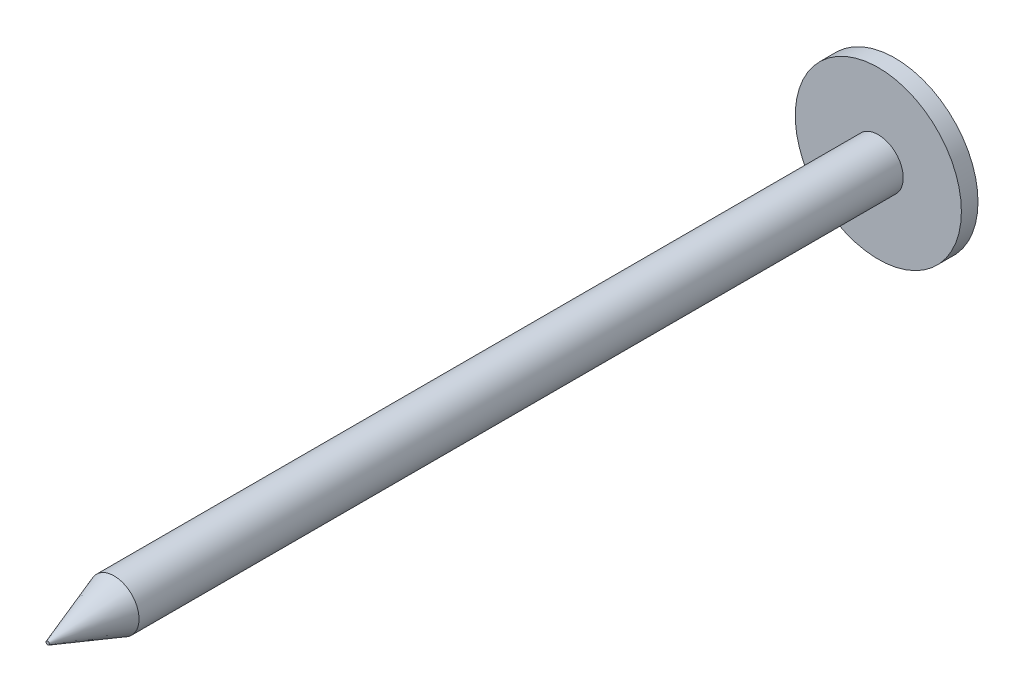
ISO-10303-21;
HEADER;
FILE_DESCRIPTION(('STEP AP214'),'2;1');
FILE_NAME('part.step','',(''),(''),'','','');
FILE_SCHEMA(('AUTOMOTIVE_DESIGN { 1 0 10303 214 1 1 1 1 }'));
ENDSEC;
DATA;
#1=APPLICATION_CONTEXT('core data for automotive mechanical design processes');
#2=APPLICATION_PROTOCOL_DEFINITION('international standard','automotive_design',2000,#1);
#3=PRODUCT_CONTEXT('',#1,'mechanical');
#4=PRODUCT('Part','Part','',(#3));
#5=PRODUCT_RELATED_PRODUCT_CATEGORY('part','',(#4));
#6=PRODUCT_DEFINITION_FORMATION('','',#4);
#7=PRODUCT_DEFINITION_CONTEXT('part definition',#1,'design');
#8=PRODUCT_DEFINITION('design','',#6,#7);
#9=PRODUCT_DEFINITION_SHAPE('','',#8);
#10=(LENGTH_UNIT() NAMED_UNIT(*) SI_UNIT(.MILLI.,.METRE.));
#11=(NAMED_UNIT(*) PLANE_ANGLE_UNIT() SI_UNIT($,.RADIAN.));
#12=(NAMED_UNIT(*) SI_UNIT($,.STERADIAN.) SOLID_ANGLE_UNIT());
#13=UNCERTAINTY_MEASURE_WITH_UNIT(LENGTH_MEASURE(1.E-05),#10,'distance_accuracy_value','');
#14=(GEOMETRIC_REPRESENTATION_CONTEXT(3) GLOBAL_UNCERTAINTY_ASSIGNED_CONTEXT((#13)) GLOBAL_UNIT_ASSIGNED_CONTEXT((#10,
#11,#12)) REPRESENTATION_CONTEXT('',''));
#15=CARTESIAN_POINT('',(0.,0.,0.));
#16=DIRECTION('',(0.,0.,1.));
#17=DIRECTION('',(1.,0.,0.));
#18=AXIS2_PLACEMENT_3D('',#15,#16,#17);
#19=CARTESIAN_POINT('',(0.,0.,0.499999999999945));
#20=DIRECTION('',(0.,0.,1.));
#21=DIRECTION('',(1.,0.,0.));
#22=AXIS2_PLACEMENT_3D('',#19,#20,#21);
#23=PLANE('',#22);
#24=CARTESIAN_POINT('',(0.,0.,0.499999999999945));
#25=DIRECTION('',(0.,0.,1.));
#26=DIRECTION('',(1.,0.,0.));
#27=AXIS2_PLACEMENT_3D('',#24,#25,#26);
#28=CIRCLE('',#27,2.5);
#29=CARTESIAN_POINT('',(2.5,0.,0.499999999999945));
#30=VERTEX_POINT('',#29);
#31=EDGE_CURVE('E45',#30,#30,#28,.T.);
#32=ORIENTED_EDGE('',*,*,#31,.T.);
#33=EDGE_LOOP('',(#32));
#34=FACE_BOUND('',#33,.T.);
#35=CARTESIAN_POINT('',(0.,0.,0.499999999999945));
#36=DIRECTION('',(0.,0.,1.));
#37=DIRECTION('',(1.,0.,0.));
#38=AXIS2_PLACEMENT_3D('',#35,#36,#37);
#39=CIRCLE('',#38,0.75);
#40=CARTESIAN_POINT('',(0.75,0.,0.499999999999945));
#41=VERTEX_POINT('',#40);
#42=EDGE_CURVE('E53',#41,#41,#39,.T.);
#43=ORIENTED_EDGE('',*,*,#42,.F.);
#44=EDGE_LOOP('',(#43));
#45=FACE_BOUND('',#44,.T.);
#46=ADVANCED_FACE('F34',(#34,#45),#23,.T.);
#47=CARTESIAN_POINT('',(0.,0.,0.499999999999945));
#48=DIRECTION('',(0.,0.,-1.));
#49=DIRECTION('',(-1.,0.,0.));
#50=AXIS2_PLACEMENT_3D('',#47,#48,#49);
#51=CYLINDRICAL_SURFACE('',#50,2.5);
#52=ORIENTED_EDGE('',*,*,#31,.F.);
#53=EDGE_LOOP('',(#52));
#54=FACE_BOUND('',#53,.T.);
#55=CARTESIAN_POINT('',(0.,0.,0.));
#56=DIRECTION('',(0.,0.,1.));
#57=DIRECTION('',(1.,0.,0.));
#58=AXIS2_PLACEMENT_3D('',#55,#56,#57);
#59=CIRCLE('',#58,2.5);
#60=CARTESIAN_POINT('',(2.5,0.,0.));
#61=VERTEX_POINT('',#60);
#62=EDGE_CURVE('E49',#61,#61,#59,.T.);
#63=ORIENTED_EDGE('',*,*,#62,.T.);
#64=EDGE_LOOP('',(#63));
#65=FACE_BOUND('',#64,.T.);
#66=ADVANCED_FACE('F61',(#54,#65),#51,.T.);
#67=CARTESIAN_POINT('',(0.,0.,0.));
#68=DIRECTION('',(0.,0.,1.));
#69=DIRECTION('',(1.,0.,0.));
#70=AXIS2_PLACEMENT_3D('',#67,#68,#69);
#71=PLANE('',#70);
#72=ORIENTED_EDGE('',*,*,#62,.F.);
#73=EDGE_LOOP('',(#72));
#74=FACE_BOUND('',#73,.T.);
#75=ADVANCED_FACE('F67',(#74),#71,.F.);
#76=CARTESIAN_POINT('',(0.,0.,25.5));
#77=DIRECTION('',(0.,0.,-1.));
#78=DIRECTION('',(-1.,0.,0.));
#79=AXIS2_PLACEMENT_3D('',#76,#77,#78);
#80=CYLINDRICAL_SURFACE('',#79,0.75);
#81=CARTESIAN_POINT('',(0.,0.,23.5));
#82=DIRECTION('',(0.,0.,1.));
#83=DIRECTION('',(1.,0.,0.));
#84=AXIS2_PLACEMENT_3D('',#81,#82,#83);
#85=CIRCLE('',#84,0.75);
#86=CARTESIAN_POINT('',(-0.749999999999993,0.,23.5));
#87=VERTEX_POINT('',#86);
#88=EDGE_CURVE('E10',#87,#87,#85,.F.);
#89=ORIENTED_EDGE('',*,*,#88,.T.);
#90=EDGE_LOOP('',(#89));
#91=FACE_BOUND('',#90,.T.);
#92=ORIENTED_EDGE('',*,*,#42,.T.);
#93=EDGE_LOOP('',(#92));
#94=FACE_BOUND('',#93,.T.);
#95=ADVANCED_FACE('F58',(#91,#94),#80,.T.);
#96=CARTESIAN_POINT('',(0.,0.,25.5));
#97=DIRECTION('',(0.,0.,1.));
#98=DIRECTION('',(1.,0.,0.));
#99=AXIS2_PLACEMENT_3D('',#96,#97,#98);
#100=PLANE('',#99);
#101=CARTESIAN_POINT('',(0.,0.,25.5));
#102=DIRECTION('',(0.,0.,1.));
#103=DIRECTION('',(1.,0.,0.));
#104=AXIS2_PLACEMENT_3D('',#101,#102,#103);
#105=CIRCLE('',#104,0.0499999999999997);
#106=CARTESIAN_POINT('',(-0.0500000000000003,0.,25.5));
#107=VERTEX_POINT('',#106);
#108=EDGE_CURVE('E41',#107,#107,#105,.T.);
#109=ORIENTED_EDGE('',*,*,#108,.T.);
#110=EDGE_LOOP('',(#109));
#111=FACE_BOUND('',#110,.T.);
#112=ADVANCED_FACE('F77',(#111),#100,.T.);
#113=CARTESIAN_POINT('',(0.,0.,25.5));
#114=DIRECTION('',(0.,0.,-1.));
#115=DIRECTION('',(-1.,0.,0.));
#116=AXIS2_PLACEMENT_3D('',#113,#114,#115);
#117=CONICAL_SURFACE('',#116,0.0499999999999997,0.336674819386724);
#118=CARTESIAN_POINT('',(-0.749999999999993,0.,23.5));
#119=CARTESIAN_POINT('',(-0.742708333333327,0.,23.5208333333333));
#120=CARTESIAN_POINT('',(-0.73541666666666,0.,23.5416666666666));
#121=CARTESIAN_POINT('',(-0.720833333333327,0.,23.5833333333333));
#122=CARTESIAN_POINT('',(-0.713541666666661,0.,23.6041666666666));
#123=CARTESIAN_POINT('',(-0.698958333333327,0.,23.6458333333333));
#124=CARTESIAN_POINT('',(-0.691666666666661,0.,23.6666666666666));
#125=CARTESIAN_POINT('',(-0.677083333333327,0.,23.7083333333333));
#126=CARTESIAN_POINT('',(-0.669791666666661,0.,23.7291666666666));
#127=CARTESIAN_POINT('',(-0.655208333333328,0.,23.7708333333333));
#128=CARTESIAN_POINT('',(-0.647916666666661,0.,23.7916666666666));
#129=CARTESIAN_POINT('',(-0.633333333333328,0.,23.8333333333333));
#130=CARTESIAN_POINT('',(-0.626041666666661,0.,23.8541666666666));
#131=CARTESIAN_POINT('',(-0.611458333333328,0.,23.8958333333333));
#132=CARTESIAN_POINT('',(-0.604166666666662,0.,23.9166666666666));
#133=CARTESIAN_POINT('',(-0.589583333333328,0.,23.9583333333333));
#134=CARTESIAN_POINT('',(-0.582291666666662,0.,23.9791666666666));
#135=CARTESIAN_POINT('',(-0.567708333333328,0.,24.0208333333333));
#136=CARTESIAN_POINT('',(-0.560416666666662,0.,24.0416666666666));
#137=CARTESIAN_POINT('',(-0.545833333333329,0.,24.0833333333333));
#138=CARTESIAN_POINT('',(-0.538541666666662,0.,24.1041666666666));
#139=CARTESIAN_POINT('',(-0.523958333333329,0.,24.1458333333333));
#140=CARTESIAN_POINT('',(-0.516666666666662,0.,24.1666666666666));
#141=CARTESIAN_POINT('',(-0.502083333333329,0.,24.2083333333333));
#142=CARTESIAN_POINT('',(-0.494791666666663,0.,24.2291666666666));
#143=CARTESIAN_POINT('',(-0.480208333333329,0.,24.2708333333333));
#144=CARTESIAN_POINT('',(-0.472916666666663,0.,24.2916666666666));
#145=CARTESIAN_POINT('',(-0.45833333333333,0.,24.3333333333333));
#146=CARTESIAN_POINT('',(-0.451041666666663,0.,24.3541666666666));
#147=CARTESIAN_POINT('',(-0.43645833333333,0.,24.3958333333333));
#148=CARTESIAN_POINT('',(-0.429166666666663,0.,24.4166666666666));
#149=CARTESIAN_POINT('',(-0.41458333333333,0.,24.4583333333333));
#150=CARTESIAN_POINT('',(-0.407291666666663,0.,24.4791666666666));
#151=CARTESIAN_POINT('',(-0.39270833333333,0.,24.5208333333333));
#152=CARTESIAN_POINT('',(-0.385416666666664,0.,24.5416666666666));
#153=CARTESIAN_POINT('',(-0.37083333333333,0.,24.5833333333333));
#154=CARTESIAN_POINT('',(-0.363541666666664,0.,24.6041666666666));
#155=CARTESIAN_POINT('',(-0.348958333333331,0.,24.6458333333333));
#156=CARTESIAN_POINT('',(-0.341666666666664,0.,24.6666666666666));
#157=CARTESIAN_POINT('',(-0.327083333333331,0.,24.7083333333333));
#158=CARTESIAN_POINT('',(-0.319791666666664,0.,24.7291666666666));
#159=CARTESIAN_POINT('',(-0.305208333333331,0.,24.7708333333333));
#160=CARTESIAN_POINT('',(-0.297916666666665,0.,24.7916666666666));
#161=CARTESIAN_POINT('',(-0.283333333333331,0.,24.8333333333333));
#162=CARTESIAN_POINT('',(-0.276041666666665,0.,24.8541666666666));
#163=CARTESIAN_POINT('',(-0.261458333333332,0.,24.8958333333333));
#164=CARTESIAN_POINT('',(-0.254166666666665,0.,24.9166666666666));
#165=CARTESIAN_POINT('',(-0.239583333333332,0.,24.9583333333333));
#166=CARTESIAN_POINT('',(-0.232291666666665,0.,24.9791666666666));
#167=CARTESIAN_POINT('',(-0.217708333333332,0.,25.0208333333333));
#168=CARTESIAN_POINT('',(-0.210416666666665,0.,25.0416666666666));
#169=CARTESIAN_POINT('',(-0.195833333333332,0.,25.0833333333333));
#170=CARTESIAN_POINT('',(-0.188541666666666,0.,25.1041666666666));
#171=CARTESIAN_POINT('',(-0.173958333333332,0.,25.1458333333333));
#172=CARTESIAN_POINT('',(-0.166666666666666,0.,25.1666666666666));
#173=CARTESIAN_POINT('',(-0.152083333333333,0.,25.2083333333333));
#174=CARTESIAN_POINT('',(-0.144791666666666,0.,25.2291666666666));
#175=CARTESIAN_POINT('',(-0.130208333333333,0.,25.2708333333333));
#176=CARTESIAN_POINT('',(-0.122916666666666,0.,25.2916666666666));
#177=CARTESIAN_POINT('',(-0.108333333333333,0.,25.3333333333333));
#178=CARTESIAN_POINT('',(-0.101041666666666,0.,25.3541666666666));
#179=CARTESIAN_POINT('',(-0.0864583333333333,0.,25.3958333333333));
#180=CARTESIAN_POINT('',(-0.0791666666666667,0.,25.4166666666666));
#181=CARTESIAN_POINT('',(-0.0645833333333335,0.,25.4583333333333));
#182=CARTESIAN_POINT('',(-0.0572916666666669,0.,25.4791666666666));
#183=CARTESIAN_POINT('',(-0.0500000000000003,0.,25.5));
#184=B_SPLINE_CURVE_WITH_KNOTS('',3,(#118,#119,#120,#121,#122,#123,#124,#125,#126,#127,#128,
#129,#130,#131,#132,#133,#134,#135,#136,#137,#138,#139,#140,#141,#142,#143,#144,#145,#146,#147,
#148,#149,#150,#151,#152,#153,#154,#155,#156,#157,#158,#159,#160,#161,#162,#163,#164,#165,#166,
#167,#168,#169,#170,#171,#172,#173,#174,#175,#176,#177,#178,#179,#180,#181,#182,#183),
.UNSPECIFIED.,.F.,.F.,(4,2,2,2,2,2,2,2,2,2,2,2,2,2,2,2,2,2,2,2,2,2,2,2,2,2,2,2,2,2,2,2,4),(0.,
0.0662175628138034,0.132435125627607,0.19865268844141,0.264870251255214,0.331087814069017,
0.39730537688282,0.463522939696624,0.529740502510427,0.595958065324231,0.662175628138034,
0.728393190951837,0.794610753765641,0.860828316579444,0.927045879393248,0.993263442207051,
1.05948100502085,1.12569856783466,1.19191613064846,1.25813369346226,1.32435125627607,
1.39056881908987,1.45678638190367,1.52300394471748,1.58922150753128,1.65543907034508,
1.72165663315889,1.78787419597269,1.85409175878649,1.9203093216003,1.9865268844141,
2.0527444472279,2.11896201004171),.UNSPECIFIED.);
#185=EDGE_CURVE('BSEAM36',#87,#107,#184,.T.);
#186=ORIENTED_EDGE('',*,*,#88,.F.);
#187=ORIENTED_EDGE('',*,*,#108,.F.);
#188=ORIENTED_EDGE('',*,*,#185,.T.);
#189=ORIENTED_EDGE('',*,*,#185,.F.);
#190=EDGE_LOOP('',(#186,#188,#187,#189));
#191=FACE_BOUND('',#190,.T.);
#192=ADVANCED_FACE('F36',(#191),#117,.T.);
#193=CLOSED_SHELL('',(#46,#66,#75,#95,#112,#192));
#194=MANIFOLD_SOLID_BREP('B2',#193);
#195=ADVANCED_BREP_SHAPE_REPRESENTATION('',(#18,#194),#14);
#196=SHAPE_DEFINITION_REPRESENTATION(#9,#195);
ENDSEC;
END-ISO-10303-21;
